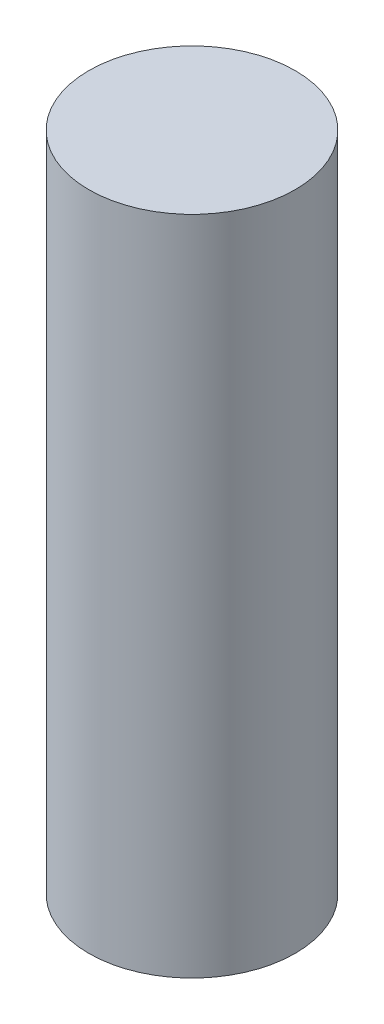
ISO-10303-21;
HEADER;
FILE_DESCRIPTION(('STEP AP214'),'2;1');
FILE_NAME('part.step','',(''),(''),'','','');
FILE_SCHEMA(('AUTOMOTIVE_DESIGN { 1 0 10303 214 1 1 1 1 }'));
ENDSEC;
DATA;
#1=APPLICATION_CONTEXT('core data for automotive mechanical design processes');
#2=APPLICATION_PROTOCOL_DEFINITION('international standard','automotive_design',2000,#1);
#3=PRODUCT_CONTEXT('',#1,'mechanical');
#4=PRODUCT('Part','Part','',(#3));
#5=PRODUCT_RELATED_PRODUCT_CATEGORY('part','',(#4));
#6=PRODUCT_DEFINITION_FORMATION('','',#4);
#7=PRODUCT_DEFINITION_CONTEXT('part definition',#1,'design');
#8=PRODUCT_DEFINITION('design','',#6,#7);
#9=PRODUCT_DEFINITION_SHAPE('','',#8);
#10=(LENGTH_UNIT() NAMED_UNIT(*) SI_UNIT(.MILLI.,.METRE.));
#11=(NAMED_UNIT(*) PLANE_ANGLE_UNIT() SI_UNIT($,.RADIAN.));
#12=(NAMED_UNIT(*) SI_UNIT($,.STERADIAN.) SOLID_ANGLE_UNIT());
#13=UNCERTAINTY_MEASURE_WITH_UNIT(LENGTH_MEASURE(1.E-05),#10,'distance_accuracy_value','');
#14=(GEOMETRIC_REPRESENTATION_CONTEXT(3) GLOBAL_UNCERTAINTY_ASSIGNED_CONTEXT((#13)) GLOBAL_UNIT_ASSIGNED_CONTEXT((#10,
#11,#12)) REPRESENTATION_CONTEXT('',''));
#15=CARTESIAN_POINT('',(0.,0.,0.));
#16=DIRECTION('',(0.,0.,1.));
#17=DIRECTION('',(1.,0.,0.));
#18=AXIS2_PLACEMENT_3D('',#15,#16,#17);
#19=CARTESIAN_POINT('',(0.,25.4,0.));
#20=DIRECTION('',(0.,-1.,0.));
#21=DIRECTION('',(0.,0.,-1.));
#22=AXIS2_PLACEMENT_3D('',#19,#20,#21);
#23=CYLINDRICAL_SURFACE('',#22,3.9624);
#24=CARTESIAN_POINT('',(0.,25.4,0.));
#25=DIRECTION('',(0.,1.,0.));
#26=DIRECTION('',(0.,0.,1.));
#27=AXIS2_PLACEMENT_3D('',#24,#25,#26);
#28=CIRCLE('',#27,3.9624);
#29=CARTESIAN_POINT('',(0.,25.4,3.9624));
#30=VERTEX_POINT('',#29);
#31=EDGE_CURVE('E10',#30,#30,#28,.T.);
#32=ORIENTED_EDGE('',*,*,#31,.F.);
#33=EDGE_LOOP('',(#32));
#34=FACE_BOUND('',#33,.T.);
#35=CARTESIAN_POINT('',(0.,0.,0.));
#36=DIRECTION('',(0.,1.,0.));
#37=DIRECTION('',(0.,0.,1.));
#38=AXIS2_PLACEMENT_3D('',#35,#36,#37);
#39=CIRCLE('',#38,3.9624);
#40=CARTESIAN_POINT('',(0.,0.,3.9624));
#41=VERTEX_POINT('',#40);
#42=EDGE_CURVE('E37',#41,#41,#39,.T.);
#43=ORIENTED_EDGE('',*,*,#42,.T.);
#44=EDGE_LOOP('',(#43));
#45=FACE_BOUND('',#44,.T.);
#46=ADVANCED_FACE('F34',(#34,#45),#23,.T.);
#47=CARTESIAN_POINT('',(0.,25.4,0.));
#48=DIRECTION('',(0.,1.,0.));
#49=DIRECTION('',(0.,0.,1.));
#50=AXIS2_PLACEMENT_3D('',#47,#48,#49);
#51=PLANE('',#50);
#52=ORIENTED_EDGE('',*,*,#31,.T.);
#53=EDGE_LOOP('',(#52));
#54=FACE_BOUND('',#53,.T.);
#55=ADVANCED_FACE('F49',(#54),#51,.T.);
#56=CARTESIAN_POINT('',(0.,0.,0.));
#57=DIRECTION('',(0.,1.,0.));
#58=DIRECTION('',(0.,0.,1.));
#59=AXIS2_PLACEMENT_3D('',#56,#57,#58);
#60=PLANE('',#59);
#61=ORIENTED_EDGE('',*,*,#42,.F.);
#62=EDGE_LOOP('',(#61));
#63=FACE_BOUND('',#62,.T.);
#64=ADVANCED_FACE('F47',(#63),#60,.F.);
#65=CLOSED_SHELL('',(#46,#55,#64));
#66=MANIFOLD_SOLID_BREP('B2',#65);
#67=ADVANCED_BREP_SHAPE_REPRESENTATION('',(#18,#66),#14);
#68=SHAPE_DEFINITION_REPRESENTATION(#9,#67);
ENDSEC;
END-ISO-10303-21;
